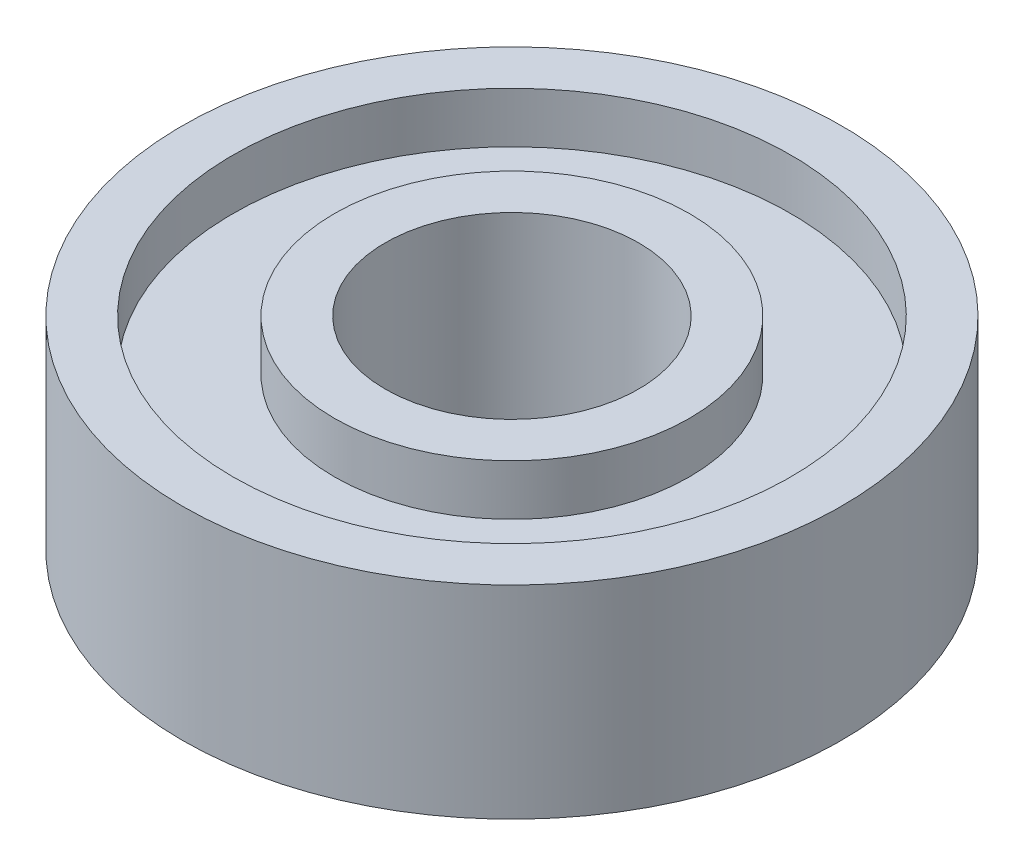
ISO-10303-21;
HEADER;
FILE_DESCRIPTION(('STEP AP214'),'2;1');
FILE_NAME('part.step','',(''),(''),'','','');
FILE_SCHEMA(('AUTOMOTIVE_DESIGN { 1 0 10303 214 1 1 1 1 }'));
ENDSEC;
DATA;
#1=APPLICATION_CONTEXT('core data for automotive mechanical design processes');
#2=APPLICATION_PROTOCOL_DEFINITION('international standard','automotive_design',2000,#1);
#3=PRODUCT_CONTEXT('',#1,'mechanical');
#4=PRODUCT('Part','Part','',(#3));
#5=PRODUCT_RELATED_PRODUCT_CATEGORY('part','',(#4));
#6=PRODUCT_DEFINITION_FORMATION('','',#4);
#7=PRODUCT_DEFINITION_CONTEXT('part definition',#1,'design');
#8=PRODUCT_DEFINITION('design','',#6,#7);
#9=PRODUCT_DEFINITION_SHAPE('','',#8);
#10=(LENGTH_UNIT() NAMED_UNIT(*) SI_UNIT(.MILLI.,.METRE.));
#11=(NAMED_UNIT(*) PLANE_ANGLE_UNIT() SI_UNIT($,.RADIAN.));
#12=(NAMED_UNIT(*) SI_UNIT($,.STERADIAN.) SOLID_ANGLE_UNIT());
#13=UNCERTAINTY_MEASURE_WITH_UNIT(LENGTH_MEASURE(1.E-05),#10,'distance_accuracy_value','');
#14=(GEOMETRIC_REPRESENTATION_CONTEXT(3) GLOBAL_UNCERTAINTY_ASSIGNED_CONTEXT((#13)) GLOBAL_UNIT_ASSIGNED_CONTEXT((#10,
#11,#12)) REPRESENTATION_CONTEXT('',''));
#15=CARTESIAN_POINT('',(0.,0.,0.));
#16=DIRECTION('',(0.,0.,1.));
#17=DIRECTION('',(1.,0.,0.));
#18=AXIS2_PLACEMENT_3D('',#15,#16,#17);
#19=CARTESIAN_POINT('',(0.,0.,0.));
#20=DIRECTION('',(0.,1.,0.));
#21=DIRECTION('',(0.,0.,1.));
#22=AXIS2_PLACEMENT_3D('',#19,#20,#21);
#23=PLANE('',#22);
#24=CARTESIAN_POINT('',(0.,0.,0.));
#25=DIRECTION('',(0.,1.,0.));
#26=DIRECTION('',(0.,0.,1.));
#27=AXIS2_PLACEMENT_3D('',#24,#25,#26);
#28=CIRCLE('',#27,2.5);
#29=CARTESIAN_POINT('',(0.,0.,2.5));
#30=VERTEX_POINT('',#29);
#31=EDGE_CURVE('E54',#30,#30,#28,.T.);
#32=ORIENTED_EDGE('',*,*,#31,.T.);
#33=EDGE_LOOP('',(#32));
#34=FACE_BOUND('',#33,.T.);
#35=CARTESIAN_POINT('',(0.,0.,0.));
#36=DIRECTION('',(0.,-1.,0.));
#37=DIRECTION('',(0.,0.,-1.));
#38=AXIS2_PLACEMENT_3D('',#35,#36,#37);
#39=CIRCLE('',#38,3.5);
#40=CARTESIAN_POINT('',(0.,0.,-3.5));
#41=VERTEX_POINT('',#40);
#42=EDGE_CURVE('E78',#41,#41,#39,.T.);
#43=ORIENTED_EDGE('',*,*,#42,.T.);
#44=EDGE_LOOP('',(#43));
#45=FACE_BOUND('',#44,.T.);
#46=ADVANCED_FACE('F41',(#34,#45),#23,.F.);
#47=CARTESIAN_POINT('',(0.,4.,0.));
#48=DIRECTION('',(0.,1.,0.));
#49=DIRECTION('',(0.,0.,1.));
#50=AXIS2_PLACEMENT_3D('',#47,#48,#49);
#51=PLANE('',#50);
#52=CARTESIAN_POINT('',(0.,4.,0.));
#53=DIRECTION('',(0.,1.,0.));
#54=DIRECTION('',(0.,0.,1.));
#55=AXIS2_PLACEMENT_3D('',#52,#53,#54);
#56=CIRCLE('',#55,2.5);
#57=CARTESIAN_POINT('',(0.,4.,2.5));
#58=VERTEX_POINT('',#57);
#59=EDGE_CURVE('E52',#58,#58,#56,.T.);
#60=ORIENTED_EDGE('',*,*,#59,.F.);
#61=EDGE_LOOP('',(#60));
#62=FACE_BOUND('',#61,.T.);
#63=CARTESIAN_POINT('',(0.,4.,0.));
#64=DIRECTION('',(0.,1.,0.));
#65=DIRECTION('',(0.,0.,1.));
#66=AXIS2_PLACEMENT_3D('',#63,#64,#65);
#67=CIRCLE('',#66,3.5);
#68=CARTESIAN_POINT('',(0.,4.,3.5));
#69=VERTEX_POINT('',#68);
#70=EDGE_CURVE('E66',#69,#69,#67,.T.);
#71=ORIENTED_EDGE('',*,*,#70,.T.);
#72=EDGE_LOOP('',(#71));
#73=FACE_BOUND('',#72,.T.);
#74=ADVANCED_FACE('F116',(#62,#73),#51,.T.);
#75=CARTESIAN_POINT('',(0.,4.,0.));
#76=DIRECTION('',(0.,1.,0.));
#77=DIRECTION('',(0.,0.,1.));
#78=AXIS2_PLACEMENT_3D('',#75,#76,#77);
#79=CIRCLE('',#78,5.5);
#80=CARTESIAN_POINT('',(0.,4.,5.5));
#81=VERTEX_POINT('',#80);
#82=EDGE_CURVE('E60',#81,#81,#79,.T.);
#83=ORIENTED_EDGE('',*,*,#82,.F.);
#84=EDGE_LOOP('',(#83));
#85=FACE_BOUND('',#84,.T.);
#86=CARTESIAN_POINT('',(0.,4.,0.));
#87=DIRECTION('',(0.,1.,0.));
#88=DIRECTION('',(0.,0.,1.));
#89=AXIS2_PLACEMENT_3D('',#86,#87,#88);
#90=CIRCLE('',#89,6.5);
#91=CARTESIAN_POINT('',(0.,4.,6.5));
#92=VERTEX_POINT('',#91);
#93=EDGE_CURVE('E10',#92,#92,#90,.T.);
#94=ORIENTED_EDGE('',*,*,#93,.T.);
#95=EDGE_LOOP('',(#94));
#96=FACE_BOUND('',#95,.T.);
#97=ADVANCED_FACE('F103',(#85,#96),#51,.T.);
#98=CARTESIAN_POINT('',(0.,0.,0.));
#99=DIRECTION('',(0.,-1.,0.));
#100=DIRECTION('',(0.,0.,-1.));
#101=AXIS2_PLACEMENT_3D('',#98,#99,#100);
#102=CIRCLE('',#101,5.5);
#103=CARTESIAN_POINT('',(0.,0.,-5.5));
#104=VERTEX_POINT('',#103);
#105=EDGE_CURVE('E72',#104,#104,#102,.T.);
#106=ORIENTED_EDGE('',*,*,#105,.F.);
#107=EDGE_LOOP('',(#106));
#108=FACE_BOUND('',#107,.T.);
#109=CARTESIAN_POINT('',(0.,0.,0.));
#110=DIRECTION('',(0.,1.,0.));
#111=DIRECTION('',(0.,0.,1.));
#112=AXIS2_PLACEMENT_3D('',#109,#110,#111);
#113=CIRCLE('',#112,6.5);
#114=CARTESIAN_POINT('',(0.,0.,6.5));
#115=VERTEX_POINT('',#114);
#116=EDGE_CURVE('E45',#115,#115,#113,.T.);
#117=ORIENTED_EDGE('',*,*,#116,.F.);
#118=EDGE_LOOP('',(#117));
#119=FACE_BOUND('',#118,.T.);
#120=ADVANCED_FACE('F100',(#108,#119),#23,.F.);
#121=CARTESIAN_POINT('',(0.,4.,0.));
#122=DIRECTION('',(0.,-1.,0.));
#123=DIRECTION('',(0.,0.,-1.));
#124=AXIS2_PLACEMENT_3D('',#121,#122,#123);
#125=CYLINDRICAL_SURFACE('',#124,6.5);
#126=ORIENTED_EDGE('',*,*,#93,.F.);
#127=EDGE_LOOP('',(#126));
#128=FACE_BOUND('',#127,.T.);
#129=ORIENTED_EDGE('',*,*,#116,.T.);
#130=EDGE_LOOP('',(#129));
#131=FACE_BOUND('',#130,.T.);
#132=ADVANCED_FACE('F43',(#128,#131),#125,.T.);
#133=CARTESIAN_POINT('',(0.,4.,0.));
#134=DIRECTION('',(0.,-1.,0.));
#135=DIRECTION('',(0.,0.,-1.));
#136=AXIS2_PLACEMENT_3D('',#133,#134,#135);
#137=CYLINDRICAL_SURFACE('',#136,2.5);
#138=ORIENTED_EDGE('',*,*,#59,.T.);
#139=EDGE_LOOP('',(#138));
#140=FACE_BOUND('',#139,.T.);
#141=ORIENTED_EDGE('',*,*,#31,.F.);
#142=EDGE_LOOP('',(#141));
#143=FACE_BOUND('',#142,.T.);
#144=ADVANCED_FACE('F107',(#140,#143),#137,.F.);
#145=CARTESIAN_POINT('',(0.,3.,0.));
#146=DIRECTION('',(0.,1.,0.));
#147=DIRECTION('',(0.,0.,1.));
#148=AXIS2_PLACEMENT_3D('',#145,#146,#147);
#149=CYLINDRICAL_SURFACE('',#148,5.5);
#150=CARTESIAN_POINT('',(0.,3.,0.));
#151=DIRECTION('',(0.,1.,0.));
#152=DIRECTION('',(0.,0.,1.));
#153=AXIS2_PLACEMENT_3D('',#150,#151,#152);
#154=CIRCLE('',#153,5.5);
#155=CARTESIAN_POINT('',(0.,3.,5.5));
#156=VERTEX_POINT('',#155);
#157=EDGE_CURVE('E57',#156,#156,#154,.T.);
#158=ORIENTED_EDGE('',*,*,#157,.F.);
#159=EDGE_LOOP('',(#158));
#160=FACE_BOUND('',#159,.T.);
#161=ORIENTED_EDGE('',*,*,#82,.T.);
#162=EDGE_LOOP('',(#161));
#163=FACE_BOUND('',#162,.T.);
#164=ADVANCED_FACE('F112',(#160,#163),#149,.F.);
#165=CARTESIAN_POINT('',(0.,3.,0.));
#166=DIRECTION('',(0.,1.,0.));
#167=DIRECTION('',(0.,0.,1.));
#168=AXIS2_PLACEMENT_3D('',#165,#166,#167);
#169=PLANE('',#168);
#170=CARTESIAN_POINT('',(0.,3.,0.));
#171=DIRECTION('',(0.,1.,0.));
#172=DIRECTION('',(0.,0.,1.));
#173=AXIS2_PLACEMENT_3D('',#170,#171,#172);
#174=CIRCLE('',#173,3.5);
#175=CARTESIAN_POINT('',(0.,3.,3.5));
#176=VERTEX_POINT('',#175);
#177=EDGE_CURVE('E63',#176,#176,#174,.T.);
#178=ORIENTED_EDGE('',*,*,#177,.F.);
#179=EDGE_LOOP('',(#178));
#180=FACE_BOUND('',#179,.T.);
#181=ORIENTED_EDGE('',*,*,#157,.T.);
#182=EDGE_LOOP('',(#181));
#183=FACE_BOUND('',#182,.T.);
#184=ADVANCED_FACE('F130',(#180,#183),#169,.T.);
#185=CARTESIAN_POINT('',(0.,3.,0.));
#186=DIRECTION('',(0.,1.,0.));
#187=DIRECTION('',(0.,0.,1.));
#188=AXIS2_PLACEMENT_3D('',#185,#186,#187);
#189=CYLINDRICAL_SURFACE('',#188,3.5);
#190=ORIENTED_EDGE('',*,*,#177,.T.);
#191=EDGE_LOOP('',(#190));
#192=FACE_BOUND('',#191,.T.);
#193=ORIENTED_EDGE('',*,*,#70,.F.);
#194=EDGE_LOOP('',(#193));
#195=FACE_BOUND('',#194,.T.);
#196=ADVANCED_FACE('F96',(#192,#195),#189,.T.);
#197=CARTESIAN_POINT('',(0.,1.,0.));
#198=DIRECTION('',(0.,-1.,0.));
#199=DIRECTION('',(0.,0.,-1.));
#200=AXIS2_PLACEMENT_3D('',#197,#198,#199);
#201=CYLINDRICAL_SURFACE('',#200,5.5);
#202=CARTESIAN_POINT('',(0.,1.,0.));
#203=DIRECTION('',(0.,-1.,0.));
#204=DIRECTION('',(0.,0.,-1.));
#205=AXIS2_PLACEMENT_3D('',#202,#203,#204);
#206=CIRCLE('',#205,5.5);
#207=CARTESIAN_POINT('',(0.,1.,-5.5));
#208=VERTEX_POINT('',#207);
#209=EDGE_CURVE('E69',#208,#208,#206,.T.);
#210=ORIENTED_EDGE('',*,*,#209,.F.);
#211=EDGE_LOOP('',(#210));
#212=FACE_BOUND('',#211,.T.);
#213=ORIENTED_EDGE('',*,*,#105,.T.);
#214=EDGE_LOOP('',(#213));
#215=FACE_BOUND('',#214,.T.);
#216=ADVANCED_FACE('F90',(#212,#215),#201,.F.);
#217=CARTESIAN_POINT('',(0.,1.,0.));
#218=DIRECTION('',(0.,-1.,0.));
#219=DIRECTION('',(0.,0.,-1.));
#220=AXIS2_PLACEMENT_3D('',#217,#218,#219);
#221=PLANE('',#220);
#222=CARTESIAN_POINT('',(0.,1.,0.));
#223=DIRECTION('',(0.,-1.,0.));
#224=DIRECTION('',(0.,0.,-1.));
#225=AXIS2_PLACEMENT_3D('',#222,#223,#224);
#226=CIRCLE('',#225,3.5);
#227=CARTESIAN_POINT('',(0.,1.,-3.5));
#228=VERTEX_POINT('',#227);
#229=EDGE_CURVE('E75',#228,#228,#226,.T.);
#230=ORIENTED_EDGE('',*,*,#229,.F.);
#231=EDGE_LOOP('',(#230));
#232=FACE_BOUND('',#231,.T.);
#233=ORIENTED_EDGE('',*,*,#209,.T.);
#234=EDGE_LOOP('',(#233));
#235=FACE_BOUND('',#234,.T.);
#236=ADVANCED_FACE('F87',(#232,#235),#221,.T.);
#237=CARTESIAN_POINT('',(0.,1.,0.));
#238=DIRECTION('',(0.,-1.,0.));
#239=DIRECTION('',(0.,0.,-1.));
#240=AXIS2_PLACEMENT_3D('',#237,#238,#239);
#241=CYLINDRICAL_SURFACE('',#240,3.5);
#242=ORIENTED_EDGE('',*,*,#229,.T.);
#243=EDGE_LOOP('',(#242));
#244=FACE_BOUND('',#243,.T.);
#245=ORIENTED_EDGE('',*,*,#42,.F.);
#246=EDGE_LOOP('',(#245));
#247=FACE_BOUND('',#246,.T.);
#248=ADVANCED_FACE('F84',(#244,#247),#241,.T.);
#249=CLOSED_SHELL('',(#46,#74,#97,#120,#132,#144,#164,#184,#196,#216,#236,#248));
#250=MANIFOLD_SOLID_BREP('B2',#249);
#251=ADVANCED_BREP_SHAPE_REPRESENTATION('',(#18,#250),#14);
#252=SHAPE_DEFINITION_REPRESENTATION(#9,#251);
ENDSEC;
END-ISO-10303-21;
